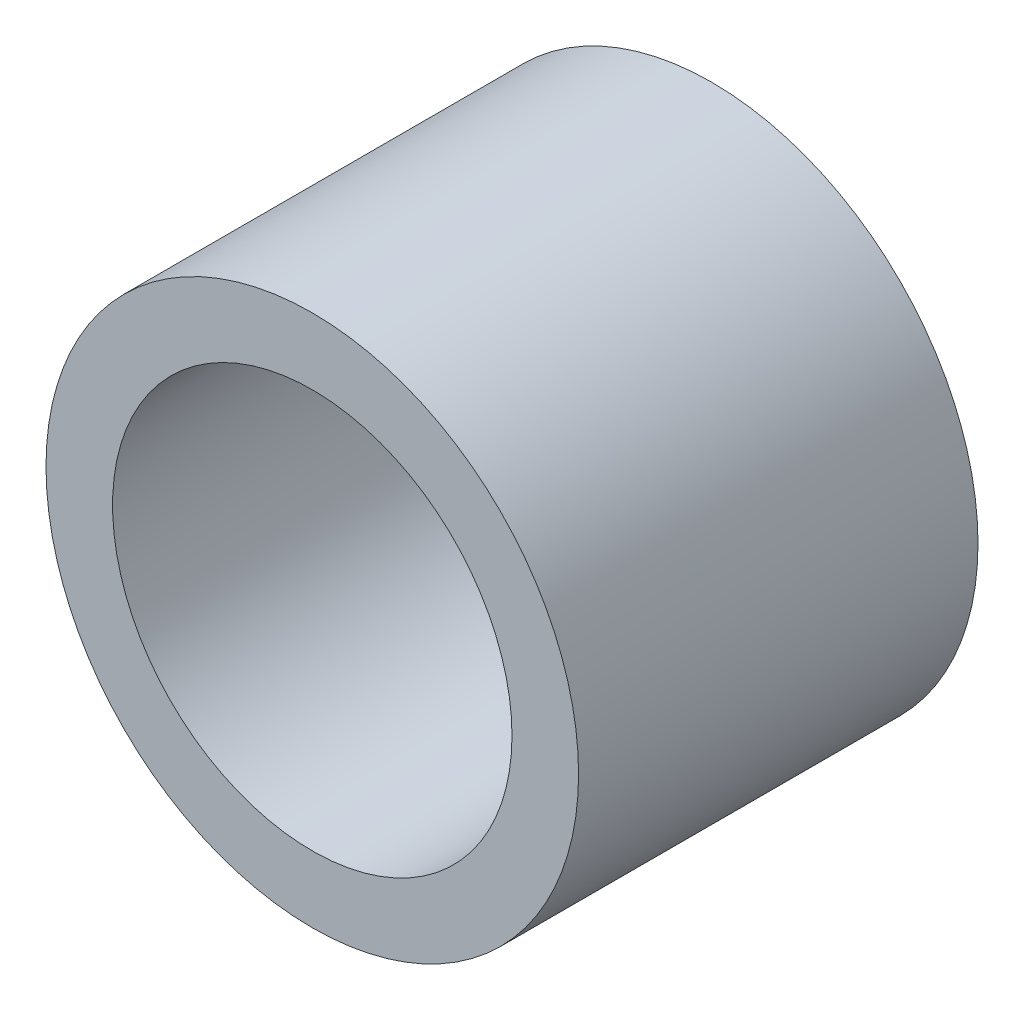
ISO-10303-21;
HEADER;
FILE_DESCRIPTION(('STEP AP214'),'2;1');
FILE_NAME('part.step','',(''),(''),'','','');
FILE_SCHEMA(('AUTOMOTIVE_DESIGN { 1 0 10303 214 1 1 1 1 }'));
ENDSEC;
DATA;
#1=APPLICATION_CONTEXT('core data for automotive mechanical design processes');
#2=APPLICATION_PROTOCOL_DEFINITION('international standard','automotive_design',2000,#1);
#3=PRODUCT_CONTEXT('',#1,'mechanical');
#4=PRODUCT('Part','Part','',(#3));
#5=PRODUCT_RELATED_PRODUCT_CATEGORY('part','',(#4));
#6=PRODUCT_DEFINITION_FORMATION('','',#4);
#7=PRODUCT_DEFINITION_CONTEXT('part definition',#1,'design');
#8=PRODUCT_DEFINITION('design','',#6,#7);
#9=PRODUCT_DEFINITION_SHAPE('','',#8);
#10=(LENGTH_UNIT() NAMED_UNIT(*) SI_UNIT(.MILLI.,.METRE.));
#11=(NAMED_UNIT(*) PLANE_ANGLE_UNIT() SI_UNIT($,.RADIAN.));
#12=(NAMED_UNIT(*) SI_UNIT($,.STERADIAN.) SOLID_ANGLE_UNIT());
#13=UNCERTAINTY_MEASURE_WITH_UNIT(LENGTH_MEASURE(1.E-05),#10,'distance_accuracy_value','');
#14=(GEOMETRIC_REPRESENTATION_CONTEXT(3) GLOBAL_UNCERTAINTY_ASSIGNED_CONTEXT((#13)) GLOBAL_UNIT_ASSIGNED_CONTEXT((#10,
#11,#12)) REPRESENTATION_CONTEXT('',''));
#15=CARTESIAN_POINT('',(0.,0.,0.));
#16=DIRECTION('',(0.,0.,1.));
#17=DIRECTION('',(1.,0.,0.));
#18=AXIS2_PLACEMENT_3D('',#15,#16,#17);
#19=CARTESIAN_POINT('',(0.,12.7,0.));
#20=DIRECTION('',(0.,0.,-1.));
#21=DIRECTION('',(-1.,0.,0.));
#22=AXIS2_PLACEMENT_3D('',#19,#20,#21);
#23=PLANE('',#22);
#24=CARTESIAN_POINT('',(0.,0.,0.));
#25=DIRECTION('',(0.,0.,1.));
#26=DIRECTION('',(1.,0.,0.));
#27=AXIS2_PLACEMENT_3D('',#24,#25,#26);
#28=CIRCLE('',#27,9.525);
#29=CARTESIAN_POINT('',(9.525,0.,0.));
#30=VERTEX_POINT('',#29);
#31=EDGE_CURVE('E10',#30,#30,#28,.T.);
#32=ORIENTED_EDGE('',*,*,#31,.F.);
#33=EDGE_LOOP('',(#32));
#34=FACE_BOUND('',#33,.T.);
#35=CARTESIAN_POINT('',(0.,0.,0.));
#36=DIRECTION('',(0.,0.,1.));
#37=DIRECTION('',(1.,0.,0.));
#38=AXIS2_PLACEMENT_3D('',#35,#36,#37);
#39=CIRCLE('',#38,12.7);
#40=CARTESIAN_POINT('',(12.7,0.,0.));
#41=VERTEX_POINT('',#40);
#42=EDGE_CURVE('E54',#41,#41,#39,.T.);
#43=ORIENTED_EDGE('',*,*,#42,.T.);
#44=EDGE_LOOP('',(#43));
#45=FACE_BOUND('',#44,.T.);
#46=ADVANCED_FACE('F37',(#34,#45),#23,.F.);
#47=CARTESIAN_POINT('',(0.,0.,23.2049382716049));
#48=DIRECTION('',(0.,0.,1.));
#49=DIRECTION('',(1.,0.,0.));
#50=AXIS2_PLACEMENT_3D('',#47,#48,#49);
#51=CYLINDRICAL_SURFACE('',#50,9.525);
#52=CARTESIAN_POINT('',(0.,0.,-19.05));
#53=DIRECTION('',(0.,0.,1.));
#54=DIRECTION('',(1.,0.,0.));
#55=AXIS2_PLACEMENT_3D('',#52,#53,#54);
#56=CIRCLE('',#55,9.525);
#57=CARTESIAN_POINT('',(9.525,0.,-19.05));
#58=VERTEX_POINT('',#57);
#59=EDGE_CURVE('E44',#58,#58,#56,.T.);
#60=ORIENTED_EDGE('',*,*,#59,.F.);
#61=EDGE_LOOP('',(#60));
#62=FACE_BOUND('',#61,.T.);
#63=ORIENTED_EDGE('',*,*,#31,.T.);
#64=EDGE_LOOP('',(#63));
#65=FACE_BOUND('',#64,.T.);
#66=ADVANCED_FACE('F70',(#62,#65),#51,.F.);
#67=CARTESIAN_POINT('',(0.,12.7,-19.05));
#68=DIRECTION('',(0.,0.,1.));
#69=DIRECTION('',(1.,0.,0.));
#70=AXIS2_PLACEMENT_3D('',#67,#68,#69);
#71=PLANE('',#70);
#72=CARTESIAN_POINT('',(0.,0.,-19.05));
#73=DIRECTION('',(0.,0.,1.));
#74=DIRECTION('',(1.,0.,0.));
#75=AXIS2_PLACEMENT_3D('',#72,#73,#74);
#76=CIRCLE('',#75,12.7);
#77=CARTESIAN_POINT('',(12.7,0.,-19.05));
#78=VERTEX_POINT('',#77);
#79=EDGE_CURVE('E49',#78,#78,#76,.T.);
#80=ORIENTED_EDGE('',*,*,#79,.F.);
#81=EDGE_LOOP('',(#80));
#82=FACE_BOUND('',#81,.T.);
#83=ORIENTED_EDGE('',*,*,#59,.T.);
#84=EDGE_LOOP('',(#83));
#85=FACE_BOUND('',#84,.T.);
#86=ADVANCED_FACE('F65',(#82,#85),#71,.F.);
#87=CARTESIAN_POINT('',(0.,0.,23.2049382716049));
#88=DIRECTION('',(0.,0.,1.));
#89=DIRECTION('',(1.,0.,0.));
#90=AXIS2_PLACEMENT_3D('',#87,#88,#89);
#91=CYLINDRICAL_SURFACE('',#90,12.7);
#92=ORIENTED_EDGE('',*,*,#42,.F.);
#93=EDGE_LOOP('',(#92));
#94=FACE_BOUND('',#93,.T.);
#95=ORIENTED_EDGE('',*,*,#79,.T.);
#96=EDGE_LOOP('',(#95));
#97=FACE_BOUND('',#96,.T.);
#98=ADVANCED_FACE('F62',(#94,#97),#91,.T.);
#99=CLOSED_SHELL('',(#46,#66,#86,#98));
#100=MANIFOLD_SOLID_BREP('B2',#99);
#101=ADVANCED_BREP_SHAPE_REPRESENTATION('',(#18,#100),#14);
#102=SHAPE_DEFINITION_REPRESENTATION(#9,#101);
ENDSEC;
END-ISO-10303-21;
